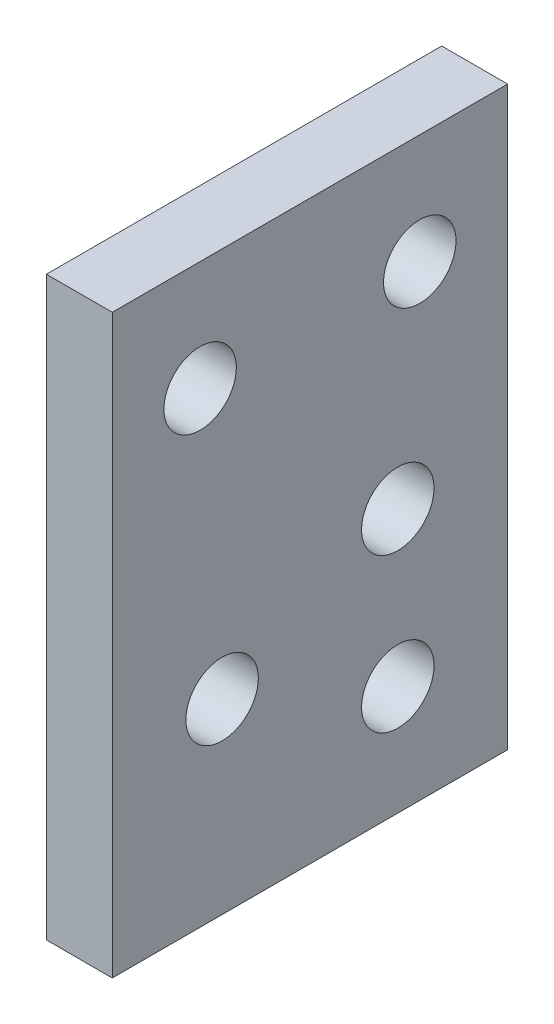
ISO-10303-21;
HEADER;
FILE_DESCRIPTION(('STEP AP214'),'2;1');
FILE_NAME('part.step','',(''),(''),'','','');
FILE_SCHEMA(('AUTOMOTIVE_DESIGN { 1 0 10303 214 1 1 1 1 }'));
ENDSEC;
DATA;
#1=APPLICATION_CONTEXT('core data for automotive mechanical design processes');
#2=APPLICATION_PROTOCOL_DEFINITION('international standard','automotive_design',2000,#1);
#3=PRODUCT_CONTEXT('',#1,'mechanical');
#4=PRODUCT('Part','Part','',(#3));
#5=PRODUCT_RELATED_PRODUCT_CATEGORY('part','',(#4));
#6=PRODUCT_DEFINITION_FORMATION('','',#4);
#7=PRODUCT_DEFINITION_CONTEXT('part definition',#1,'design');
#8=PRODUCT_DEFINITION('design','',#6,#7);
#9=PRODUCT_DEFINITION_SHAPE('','',#8);
#10=(LENGTH_UNIT() NAMED_UNIT(*) SI_UNIT(.MILLI.,.METRE.));
#11=(NAMED_UNIT(*) PLANE_ANGLE_UNIT() SI_UNIT($,.RADIAN.));
#12=(NAMED_UNIT(*) SI_UNIT($,.STERADIAN.) SOLID_ANGLE_UNIT());
#13=UNCERTAINTY_MEASURE_WITH_UNIT(LENGTH_MEASURE(1.E-05),#10,'distance_accuracy_value','');
#14=(GEOMETRIC_REPRESENTATION_CONTEXT(3) GLOBAL_UNCERTAINTY_ASSIGNED_CONTEXT((#13)) GLOBAL_UNIT_ASSIGNED_CONTEXT((#10,
#11,#12)) REPRESENTATION_CONTEXT('',''));
#15=CARTESIAN_POINT('',(0.,0.,0.));
#16=DIRECTION('',(0.,0.,1.));
#17=DIRECTION('',(1.,0.,0.));
#18=AXIS2_PLACEMENT_3D('',#15,#16,#17);
#19=CARTESIAN_POINT('',(3.,0.,0.));
#20=DIRECTION('',(1.,0.,0.));
#21=DIRECTION('',(0.,0.,-1.));
#22=AXIS2_PLACEMENT_3D('',#19,#20,#21);
#23=PLANE('',#22);
#24=CARTESIAN_POINT('',(3.,8.125,5.));
#25=DIRECTION('',(1.,0.,0.));
#26=DIRECTION('',(0.,0.,-1.));
#27=AXIS2_PLACEMENT_3D('',#24,#25,#26);
#28=CIRCLE('',#27,1.65);
#29=CARTESIAN_POINT('',(3.,8.125,3.35));
#30=VERTEX_POINT('',#29);
#31=EDGE_CURVE('E130',#30,#30,#28,.T.);
#32=ORIENTED_EDGE('',*,*,#31,.F.);
#33=EDGE_LOOP('',(#32));
#34=FACE_BOUND('',#33,.T.);
#35=CARTESIAN_POINT('',(3.,-8.125,-4.));
#36=DIRECTION('',(1.,0.,0.));
#37=DIRECTION('',(0.,0.,-1.));
#38=AXIS2_PLACEMENT_3D('',#35,#36,#37);
#39=CIRCLE('',#38,1.65);
#40=CARTESIAN_POINT('',(3.,-8.125,-5.65));
#41=VERTEX_POINT('',#40);
#42=EDGE_CURVE('E119',#41,#41,#39,.T.);
#43=ORIENTED_EDGE('',*,*,#42,.F.);
#44=EDGE_LOOP('',(#43));
#45=FACE_BOUND('',#44,.T.);
#46=DIRECTION('',(0.,-1.,0.));
#47=VECTOR('',#46,1.);
#48=CARTESIAN_POINT('',(3.,-13.125,9.));
#49=LINE('',#48,#47);
#50=CARTESIAN_POINT('',(3.,13.125,9.));
#51=VERTEX_POINT('',#50);
#52=CARTESIAN_POINT('',(3.,-13.125,9.));
#53=VERTEX_POINT('',#52);
#54=EDGE_CURVE('E87',#51,#53,#49,.T.);
#55=ORIENTED_EDGE('',*,*,#54,.T.);
#56=DIRECTION('',(0.,0.,-1.));
#57=VECTOR('',#56,1.);
#58=CARTESIAN_POINT('',(3.,-13.125,-9.));
#59=LINE('',#58,#57);
#60=CARTESIAN_POINT('',(3.,-13.125,-9.));
#61=VERTEX_POINT('',#60);
#62=EDGE_CURVE('E82',#53,#61,#59,.T.);
#63=ORIENTED_EDGE('',*,*,#62,.T.);
#64=DIRECTION('',(0.,1.,0.));
#65=VECTOR('',#64,1.);
#66=CARTESIAN_POINT('',(3.,-13.125,-9.));
#67=LINE('',#66,#65);
#68=CARTESIAN_POINT('',(3.,13.125,-9.));
#69=VERTEX_POINT('',#68);
#70=EDGE_CURVE('E85',#61,#69,#67,.T.);
#71=ORIENTED_EDGE('',*,*,#70,.T.);
#72=DIRECTION('',(0.,0.,1.));
#73=VECTOR('',#72,1.);
#74=CARTESIAN_POINT('',(3.,13.125,-9.));
#75=LINE('',#74,#73);
#76=EDGE_CURVE('E52',#69,#51,#75,.T.);
#77=ORIENTED_EDGE('',*,*,#76,.T.);
#78=EDGE_LOOP('',(#55,#63,#71,#77));
#79=FACE_BOUND('',#78,.T.);
#80=CARTESIAN_POINT('',(3.,-1.125,-4.));
#81=DIRECTION('',(1.,0.,0.));
#82=DIRECTION('',(0.,0.,-1.));
#83=AXIS2_PLACEMENT_3D('',#80,#81,#82);
#84=CIRCLE('',#83,1.65);
#85=CARTESIAN_POINT('',(3.,-1.125,-5.65));
#86=VERTEX_POINT('',#85);
#87=EDGE_CURVE('E109',#86,#86,#84,.T.);
#88=ORIENTED_EDGE('',*,*,#87,.F.);
#89=EDGE_LOOP('',(#88));
#90=FACE_BOUND('',#89,.T.);
#91=CARTESIAN_POINT('',(3.,-4.625,4.));
#92=DIRECTION('',(1.,0.,0.));
#93=DIRECTION('',(0.,0.,-1.));
#94=AXIS2_PLACEMENT_3D('',#91,#92,#93);
#95=CIRCLE('',#94,1.65);
#96=CARTESIAN_POINT('',(3.,-4.625,2.35));
#97=VERTEX_POINT('',#96);
#98=EDGE_CURVE('E129',#97,#97,#95,.T.);
#99=ORIENTED_EDGE('',*,*,#98,.F.);
#100=EDGE_LOOP('',(#99));
#101=FACE_BOUND('',#100,.T.);
#102=CARTESIAN_POINT('',(3.,8.125,-5.));
#103=DIRECTION('',(1.,0.,0.));
#104=DIRECTION('',(0.,0.,-1.));
#105=AXIS2_PLACEMENT_3D('',#102,#103,#104);
#106=CIRCLE('',#105,1.65);
#107=CARTESIAN_POINT('',(3.,8.125,-6.65));
#108=VERTEX_POINT('',#107);
#109=EDGE_CURVE('E136',#108,#108,#106,.T.);
#110=ORIENTED_EDGE('',*,*,#109,.F.);
#111=EDGE_LOOP('',(#110));
#112=FACE_BOUND('',#111,.T.);
#113=ADVANCED_FACE('F35',(#34,#45,#79,#90,#101,#112),#23,.T.);
#114=CARTESIAN_POINT('',(0.,0.,0.));
#115=DIRECTION('',(1.,0.,0.));
#116=DIRECTION('',(0.,0.,-1.));
#117=AXIS2_PLACEMENT_3D('',#114,#115,#116);
#118=PLANE('',#117);
#119=DIRECTION('',(0.,-1.,0.));
#120=VECTOR('',#119,1.);
#121=CARTESIAN_POINT('',(0.,-13.125,9.));
#122=LINE('',#121,#120);
#123=CARTESIAN_POINT('',(0.,13.125,9.));
#124=VERTEX_POINT('',#123);
#125=CARTESIAN_POINT('',(0.,-13.125,9.));
#126=VERTEX_POINT('',#125);
#127=EDGE_CURVE('E114',#124,#126,#122,.T.);
#128=ORIENTED_EDGE('',*,*,#127,.F.);
#129=DIRECTION('',(0.,0.,1.));
#130=VECTOR('',#129,1.);
#131=CARTESIAN_POINT('',(0.,13.125,-9.));
#132=LINE('',#131,#130);
#133=CARTESIAN_POINT('',(0.,13.125,-9.));
#134=VERTEX_POINT('',#133);
#135=EDGE_CURVE('E75',#134,#124,#132,.T.);
#136=ORIENTED_EDGE('',*,*,#135,.F.);
#137=DIRECTION('',(0.,1.,0.));
#138=VECTOR('',#137,1.);
#139=CARTESIAN_POINT('',(0.,-13.125,-9.));
#140=LINE('',#139,#138);
#141=CARTESIAN_POINT('',(0.,-13.125,-9.));
#142=VERTEX_POINT('',#141);
#143=EDGE_CURVE('E69',#142,#134,#140,.T.);
#144=ORIENTED_EDGE('',*,*,#143,.F.);
#145=DIRECTION('',(0.,0.,-1.));
#146=VECTOR('',#145,1.);
#147=CARTESIAN_POINT('',(0.,-13.125,-9.));
#148=LINE('',#147,#146);
#149=EDGE_CURVE('E91',#126,#142,#148,.T.);
#150=ORIENTED_EDGE('',*,*,#149,.F.);
#151=EDGE_LOOP('',(#128,#136,#144,#150));
#152=FACE_BOUND('',#151,.T.);
#153=CARTESIAN_POINT('',(0.,-1.125,-4.));
#154=DIRECTION('',(1.,0.,0.));
#155=DIRECTION('',(0.,0.,-1.));
#156=AXIS2_PLACEMENT_3D('',#153,#154,#155);
#157=CIRCLE('',#156,1.65);
#158=CARTESIAN_POINT('',(0.,-1.125,-5.65));
#159=VERTEX_POINT('',#158);
#160=EDGE_CURVE('E115',#159,#159,#157,.T.);
#161=ORIENTED_EDGE('',*,*,#160,.T.);
#162=EDGE_LOOP('',(#161));
#163=FACE_BOUND('',#162,.T.);
#164=CARTESIAN_POINT('',(0.,-8.125,-4.));
#165=DIRECTION('',(1.,0.,0.));
#166=DIRECTION('',(0.,0.,-1.));
#167=AXIS2_PLACEMENT_3D('',#164,#165,#166);
#168=CIRCLE('',#167,1.65);
#169=CARTESIAN_POINT('',(0.,-8.125,-5.65));
#170=VERTEX_POINT('',#169);
#171=EDGE_CURVE('E116',#170,#170,#168,.T.);
#172=ORIENTED_EDGE('',*,*,#171,.T.);
#173=EDGE_LOOP('',(#172));
#174=FACE_BOUND('',#173,.T.);
#175=CARTESIAN_POINT('',(0.,-4.625,4.));
#176=DIRECTION('',(1.,0.,0.));
#177=DIRECTION('',(0.,0.,-1.));
#178=AXIS2_PLACEMENT_3D('',#175,#176,#177);
#179=CIRCLE('',#178,1.65);
#180=CARTESIAN_POINT('',(0.,-4.625,2.35));
#181=VERTEX_POINT('',#180);
#182=EDGE_CURVE('E127',#181,#181,#179,.T.);
#183=ORIENTED_EDGE('',*,*,#182,.T.);
#184=EDGE_LOOP('',(#183));
#185=FACE_BOUND('',#184,.T.);
#186=CARTESIAN_POINT('',(0.,8.125,5.));
#187=DIRECTION('',(1.,0.,0.));
#188=DIRECTION('',(0.,0.,-1.));
#189=AXIS2_PLACEMENT_3D('',#186,#187,#188);
#190=CIRCLE('',#189,1.65);
#191=CARTESIAN_POINT('',(0.,8.125,3.35));
#192=VERTEX_POINT('',#191);
#193=EDGE_CURVE('E134',#192,#192,#190,.T.);
#194=ORIENTED_EDGE('',*,*,#193,.T.);
#195=EDGE_LOOP('',(#194));
#196=FACE_BOUND('',#195,.T.);
#197=CARTESIAN_POINT('',(0.,8.125,-5.));
#198=DIRECTION('',(1.,0.,0.));
#199=DIRECTION('',(0.,0.,-1.));
#200=AXIS2_PLACEMENT_3D('',#197,#198,#199);
#201=CIRCLE('',#200,1.65);
#202=CARTESIAN_POINT('',(0.,8.125,-6.65));
#203=VERTEX_POINT('',#202);
#204=EDGE_CURVE('E140',#203,#203,#201,.T.);
#205=ORIENTED_EDGE('',*,*,#204,.T.);
#206=EDGE_LOOP('',(#205));
#207=FACE_BOUND('',#206,.T.);
#208=ADVANCED_FACE('F150',(#152,#163,#174,#185,#196,#207),#118,.F.);
#209=CARTESIAN_POINT('',(3.,-13.125,9.));
#210=DIRECTION('',(0.,0.,-1.));
#211=DIRECTION('',(-1.,0.,0.));
#212=AXIS2_PLACEMENT_3D('',#209,#210,#211);
#213=PLANE('',#212);
#214=ORIENTED_EDGE('',*,*,#127,.T.);
#215=DIRECTION('',(-1.,0.,0.));
#216=VECTOR('',#215,1.);
#217=CARTESIAN_POINT('',(3.,-13.125,9.));
#218=LINE('',#217,#216);
#219=EDGE_CURVE('E12',#53,#126,#218,.T.);
#220=ORIENTED_EDGE('',*,*,#219,.F.);
#221=ORIENTED_EDGE('',*,*,#54,.F.);
#222=DIRECTION('',(-1.,0.,0.));
#223=VECTOR('',#222,1.);
#224=CARTESIAN_POINT('',(3.,13.125,9.));
#225=LINE('',#224,#223);
#226=EDGE_CURVE('E95',#51,#124,#225,.T.);
#227=ORIENTED_EDGE('',*,*,#226,.T.);
#228=EDGE_LOOP('',(#214,#220,#221,#227));
#229=FACE_BOUND('',#228,.T.);
#230=ADVANCED_FACE('F37',(#229),#213,.F.);
#231=CARTESIAN_POINT('',(3.,-13.125,-9.));
#232=DIRECTION('',(0.,1.,0.));
#233=DIRECTION('',(0.,0.,1.));
#234=AXIS2_PLACEMENT_3D('',#231,#232,#233);
#235=PLANE('',#234);
#236=ORIENTED_EDGE('',*,*,#149,.T.);
#237=DIRECTION('',(-1.,0.,0.));
#238=VECTOR('',#237,1.);
#239=CARTESIAN_POINT('',(3.,-13.125,-9.));
#240=LINE('',#239,#238);
#241=EDGE_CURVE('E44',#61,#142,#240,.T.);
#242=ORIENTED_EDGE('',*,*,#241,.F.);
#243=ORIENTED_EDGE('',*,*,#62,.F.);
#244=ORIENTED_EDGE('',*,*,#219,.T.);
#245=EDGE_LOOP('',(#236,#242,#243,#244));
#246=FACE_BOUND('',#245,.T.);
#247=ADVANCED_FACE('F90',(#246),#235,.F.);
#248=CARTESIAN_POINT('',(3.,-13.125,-9.));
#249=DIRECTION('',(0.,0.,1.));
#250=DIRECTION('',(0.,-1.,0.));
#251=AXIS2_PLACEMENT_3D('',#248,#249,#250);
#252=PLANE('',#251);
#253=ORIENTED_EDGE('',*,*,#143,.T.);
#254=DIRECTION('',(-1.,0.,0.));
#255=VECTOR('',#254,1.);
#256=CARTESIAN_POINT('',(3.,13.125,-9.));
#257=LINE('',#256,#255);
#258=EDGE_CURVE('E92',#69,#134,#257,.T.);
#259=ORIENTED_EDGE('',*,*,#258,.F.);
#260=ORIENTED_EDGE('',*,*,#70,.F.);
#261=ORIENTED_EDGE('',*,*,#241,.T.);
#262=EDGE_LOOP('',(#253,#259,#260,#261));
#263=FACE_BOUND('',#262,.T.);
#264=ADVANCED_FACE('F93',(#263),#252,.F.);
#265=CARTESIAN_POINT('',(3.,13.125,-9.));
#266=DIRECTION('',(0.,-1.,0.));
#267=DIRECTION('',(0.,0.,-1.));
#268=AXIS2_PLACEMENT_3D('',#265,#266,#267);
#269=PLANE('',#268);
#270=ORIENTED_EDGE('',*,*,#135,.T.);
#271=ORIENTED_EDGE('',*,*,#226,.F.);
#272=ORIENTED_EDGE('',*,*,#76,.F.);
#273=ORIENTED_EDGE('',*,*,#258,.T.);
#274=EDGE_LOOP('',(#270,#271,#272,#273));
#275=FACE_BOUND('',#274,.T.);
#276=ADVANCED_FACE('F164',(#275),#269,.F.);
#277=CARTESIAN_POINT('',(3.,-1.125,-4.));
#278=DIRECTION('',(-1.,0.,0.));
#279=DIRECTION('',(0.,0.,1.));
#280=AXIS2_PLACEMENT_3D('',#277,#278,#279);
#281=CYLINDRICAL_SURFACE('',#280,1.65);
#282=ORIENTED_EDGE('',*,*,#87,.T.);
#283=EDGE_LOOP('',(#282));
#284=FACE_BOUND('',#283,.T.);
#285=ORIENTED_EDGE('',*,*,#160,.F.);
#286=EDGE_LOOP('',(#285));
#287=FACE_BOUND('',#286,.T.);
#288=ADVANCED_FACE('F161',(#284,#287),#281,.F.);
#289=CARTESIAN_POINT('',(3.,-8.125,-4.));
#290=DIRECTION('',(-1.,0.,0.));
#291=DIRECTION('',(0.,0.,1.));
#292=AXIS2_PLACEMENT_3D('',#289,#290,#291);
#293=CYLINDRICAL_SURFACE('',#292,1.65);
#294=ORIENTED_EDGE('',*,*,#42,.T.);
#295=EDGE_LOOP('',(#294));
#296=FACE_BOUND('',#295,.T.);
#297=ORIENTED_EDGE('',*,*,#171,.F.);
#298=EDGE_LOOP('',(#297));
#299=FACE_BOUND('',#298,.T.);
#300=ADVANCED_FACE('F204',(#296,#299),#293,.F.);
#301=CARTESIAN_POINT('',(3.,-4.625,4.));
#302=DIRECTION('',(-1.,0.,0.));
#303=DIRECTION('',(0.,0.,1.));
#304=AXIS2_PLACEMENT_3D('',#301,#302,#303);
#305=CYLINDRICAL_SURFACE('',#304,1.65);
#306=ORIENTED_EDGE('',*,*,#98,.T.);
#307=EDGE_LOOP('',(#306));
#308=FACE_BOUND('',#307,.T.);
#309=ORIENTED_EDGE('',*,*,#182,.F.);
#310=EDGE_LOOP('',(#309));
#311=FACE_BOUND('',#310,.T.);
#312=ADVANCED_FACE('F199',(#308,#311),#305,.F.);
#313=CARTESIAN_POINT('',(3.,8.125,5.));
#314=DIRECTION('',(-1.,0.,0.));
#315=DIRECTION('',(0.,0.,1.));
#316=AXIS2_PLACEMENT_3D('',#313,#314,#315);
#317=CYLINDRICAL_SURFACE('',#316,1.65);
#318=ORIENTED_EDGE('',*,*,#31,.T.);
#319=EDGE_LOOP('',(#318));
#320=FACE_BOUND('',#319,.T.);
#321=ORIENTED_EDGE('',*,*,#193,.F.);
#322=EDGE_LOOP('',(#321));
#323=FACE_BOUND('',#322,.T.);
#324=ADVANCED_FACE('F194',(#320,#323),#317,.F.);
#325=CARTESIAN_POINT('',(3.,8.125,-5.));
#326=DIRECTION('',(-1.,0.,0.));
#327=DIRECTION('',(0.,0.,1.));
#328=AXIS2_PLACEMENT_3D('',#325,#326,#327);
#329=CYLINDRICAL_SURFACE('',#328,1.65);
#330=ORIENTED_EDGE('',*,*,#109,.T.);
#331=EDGE_LOOP('',(#330));
#332=FACE_BOUND('',#331,.T.);
#333=ORIENTED_EDGE('',*,*,#204,.F.);
#334=EDGE_LOOP('',(#333));
#335=FACE_BOUND('',#334,.T.);
#336=ADVANCED_FACE('F146',(#332,#335),#329,.F.);
#337=CLOSED_SHELL('',(#113,#208,#230,#247,#264,#276,#288,#300,#312,#324,#336));
#338=MANIFOLD_SOLID_BREP('B2',#337);
#339=ADVANCED_BREP_SHAPE_REPRESENTATION('',(#18,#338),#14);
#340=SHAPE_DEFINITION_REPRESENTATION(#9,#339);
ENDSEC;
END-ISO-10303-21;
